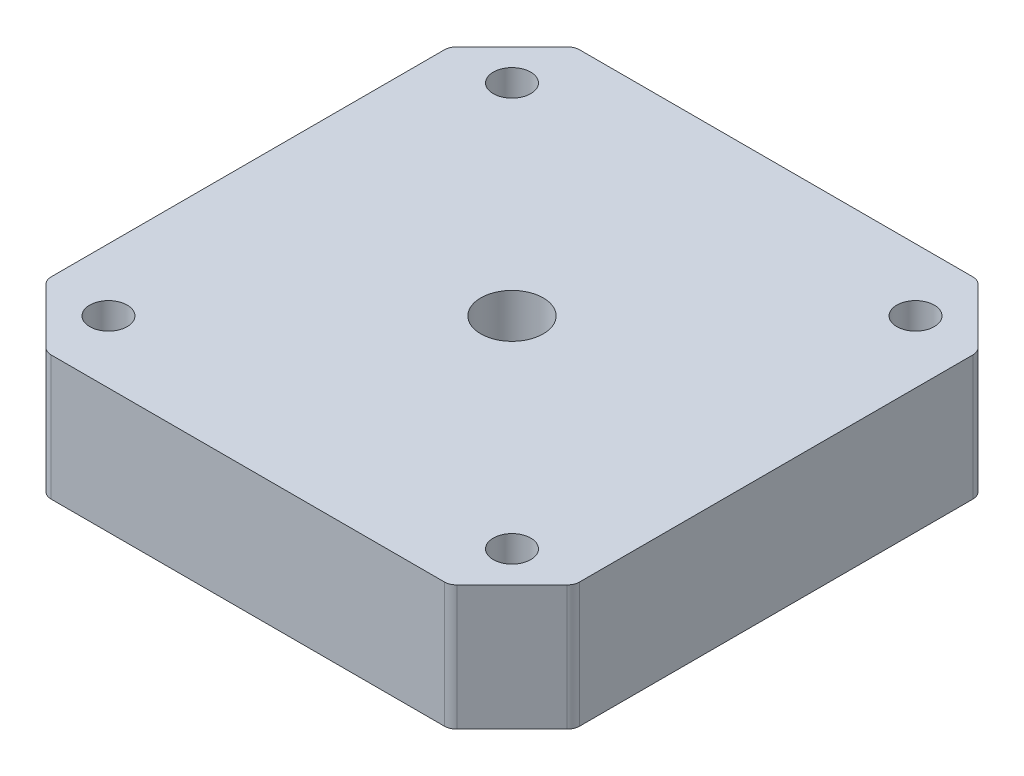
ISO-10303-21;
HEADER;
FILE_DESCRIPTION(('STEP AP214'),'2;1');
FILE_NAME('part.step','',(''),(''),'','','');
FILE_SCHEMA(('AUTOMOTIVE_DESIGN { 1 0 10303 214 1 1 1 1 }'));
ENDSEC;
DATA;
#1=APPLICATION_CONTEXT('core data for automotive mechanical design processes');
#2=APPLICATION_PROTOCOL_DEFINITION('international standard','automotive_design',2000,#1);
#3=PRODUCT_CONTEXT('',#1,'mechanical');
#4=PRODUCT('Part','Part','',(#3));
#5=PRODUCT_RELATED_PRODUCT_CATEGORY('part','',(#4));
#6=PRODUCT_DEFINITION_FORMATION('','',#4);
#7=PRODUCT_DEFINITION_CONTEXT('part definition',#1,'design');
#8=PRODUCT_DEFINITION('design','',#6,#7);
#9=PRODUCT_DEFINITION_SHAPE('','',#8);
#10=(LENGTH_UNIT() NAMED_UNIT(*) SI_UNIT(.MILLI.,.METRE.));
#11=(NAMED_UNIT(*) PLANE_ANGLE_UNIT() SI_UNIT($,.RADIAN.));
#12=(NAMED_UNIT(*) SI_UNIT($,.STERADIAN.) SOLID_ANGLE_UNIT());
#13=UNCERTAINTY_MEASURE_WITH_UNIT(LENGTH_MEASURE(1.E-05),#10,'distance_accuracy_value','');
#14=(GEOMETRIC_REPRESENTATION_CONTEXT(3) GLOBAL_UNCERTAINTY_ASSIGNED_CONTEXT((#13)) GLOBAL_UNIT_ASSIGNED_CONTEXT((#10,
#11,#12)) REPRESENTATION_CONTEXT('',''));
#15=CARTESIAN_POINT('',(0.,0.,0.));
#16=DIRECTION('',(0.,0.,1.));
#17=DIRECTION('',(1.,0.,0.));
#18=AXIS2_PLACEMENT_3D('',#15,#16,#17);
#19=CARTESIAN_POINT('',(1.,10.,-36.8857864376268));
#20=DIRECTION('',(0.,-1.,0.));
#21=DIRECTION('',(0.,0.,-1.));
#22=AXIS2_PLACEMENT_3D('',#19,#20,#21);
#23=CYLINDRICAL_SURFACE('',#22,1.);
#24=DIRECTION('',(0.,1.,0.));
#25=VECTOR('',#24,1.);
#26=CARTESIAN_POINT('',(0.292893218813445,10.,-37.5928932188133));
#27=LINE('',#26,#25);
#28=CARTESIAN_POINT('',(0.292893218813452,0.,-37.5928932188133));
#29=VERTEX_POINT('',#28);
#30=CARTESIAN_POINT('',(0.292893218813452,10.,-37.5928932188133));
#31=VERTEX_POINT('',#30);
#32=EDGE_CURVE('E246',#29,#31,#27,.T.);
#33=ORIENTED_EDGE('',*,*,#32,.F.);
#34=CARTESIAN_POINT('',(1.,0.,-36.8857864376268));
#35=DIRECTION('',(0.,1.,0.));
#36=DIRECTION('',(0.,0.,1.));
#37=AXIS2_PLACEMENT_3D('',#34,#35,#36);
#38=CIRCLE('',#37,1.);
#39=CARTESIAN_POINT('',(0.,0.,-36.8857864376268));
#40=VERTEX_POINT('',#39);
#41=EDGE_CURVE('E55',#40,#29,#38,.F.);
#42=ORIENTED_EDGE('',*,*,#41,.F.);
#43=DIRECTION('',(0.,1.,0.));
#44=VECTOR('',#43,1.);
#45=CARTESIAN_POINT('',(0.,10.,-36.8857864376268));
#46=LINE('',#45,#44);
#47=CARTESIAN_POINT('',(0.,10.,-36.8857864376268));
#48=VERTEX_POINT('',#47);
#49=EDGE_CURVE('E168',#48,#40,#46,.F.);
#50=ORIENTED_EDGE('',*,*,#49,.F.);
#51=CARTESIAN_POINT('',(1.,10.,-36.8857864376268));
#52=DIRECTION('',(0.,1.,0.));
#53=DIRECTION('',(0.,0.,1.));
#54=AXIS2_PLACEMENT_3D('',#51,#52,#53);
#55=CIRCLE('',#54,1.);
#56=EDGE_CURVE('E42',#31,#48,#55,.T.);
#57=ORIENTED_EDGE('',*,*,#56,.F.);
#58=EDGE_LOOP('',(#33,#42,#50,#57));
#59=FACE_BOUND('',#58,.T.);
#60=ADVANCED_FACE('F35',(#59),#23,.T.);
#61=CARTESIAN_POINT('',(5.41421356237311,10.,-41.3));
#62=DIRECTION('',(0.,-1.,0.));
#63=DIRECTION('',(0.,0.,-1.));
#64=AXIS2_PLACEMENT_3D('',#61,#62,#63);
#65=CYLINDRICAL_SURFACE('',#64,1.);
#66=DIRECTION('',(0.,1.,0.));
#67=VECTOR('',#66,1.);
#68=CARTESIAN_POINT('',(5.41421356237311,10.,-42.3));
#69=LINE('',#68,#67);
#70=CARTESIAN_POINT('',(5.41421356237311,0.,-42.3));
#71=VERTEX_POINT('',#70);
#72=CARTESIAN_POINT('',(5.41421356237311,10.,-42.3));
#73=VERTEX_POINT('',#72);
#74=EDGE_CURVE('E236',#71,#73,#69,.T.);
#75=ORIENTED_EDGE('',*,*,#74,.F.);
#76=CARTESIAN_POINT('',(5.41421356237311,0.,-41.3));
#77=DIRECTION('',(0.,1.,0.));
#78=DIRECTION('',(0.,0.,1.));
#79=AXIS2_PLACEMENT_3D('',#76,#77,#78);
#80=CIRCLE('',#79,1.);
#81=CARTESIAN_POINT('',(4.70710678118655,0.,-42.0071067811865));
#82=VERTEX_POINT('',#81);
#83=EDGE_CURVE('E242',#82,#71,#80,.F.);
#84=ORIENTED_EDGE('',*,*,#83,.F.);
#85=DIRECTION('',(0.,1.,0.));
#86=VECTOR('',#85,1.);
#87=CARTESIAN_POINT('',(4.70710678118655,10.,-42.0071067811865));
#88=LINE('',#87,#86);
#89=CARTESIAN_POINT('',(4.70710678118655,10.,-42.0071067811865));
#90=VERTEX_POINT('',#89);
#91=EDGE_CURVE('E239',#90,#82,#88,.F.);
#92=ORIENTED_EDGE('',*,*,#91,.F.);
#93=CARTESIAN_POINT('',(5.41421356237311,10.,-41.3));
#94=DIRECTION('',(0.,1.,0.));
#95=DIRECTION('',(0.,0.,1.));
#96=AXIS2_PLACEMENT_3D('',#93,#94,#95);
#97=CIRCLE('',#96,1.);
#98=EDGE_CURVE('E244',#73,#90,#97,.T.);
#99=ORIENTED_EDGE('',*,*,#98,.F.);
#100=EDGE_LOOP('',(#75,#84,#92,#99));
#101=FACE_BOUND('',#100,.T.);
#102=ADVANCED_FACE('F258',(#101),#65,.T.);
#103=CARTESIAN_POINT('',(36.8857864376269,10.,-41.3));
#104=DIRECTION('',(0.,1.,0.));
#105=DIRECTION('',(0.,0.,1.));
#106=AXIS2_PLACEMENT_3D('',#103,#104,#105);
#107=CYLINDRICAL_SURFACE('',#106,1.);
#108=DIRECTION('',(0.,1.,0.));
#109=VECTOR('',#108,1.);
#110=CARTESIAN_POINT('',(37.5928932188135,10.,-42.0071067811865));
#111=LINE('',#110,#109);
#112=CARTESIAN_POINT('',(37.5928932188135,0.,-42.0071067811865));
#113=VERTEX_POINT('',#112);
#114=CARTESIAN_POINT('',(37.5928932188135,10.,-42.0071067811865));
#115=VERTEX_POINT('',#114);
#116=EDGE_CURVE('E225',#113,#115,#111,.T.);
#117=ORIENTED_EDGE('',*,*,#116,.F.);
#118=CARTESIAN_POINT('',(36.8857864376269,0.,-41.3));
#119=DIRECTION('',(0.,1.,0.));
#120=DIRECTION('',(0.,0.,1.));
#121=AXIS2_PLACEMENT_3D('',#118,#119,#120);
#122=CIRCLE('',#121,1.);
#123=CARTESIAN_POINT('',(36.8857864376269,0.,-42.3));
#124=VERTEX_POINT('',#123);
#125=EDGE_CURVE('E231',#124,#113,#122,.F.);
#126=ORIENTED_EDGE('',*,*,#125,.F.);
#127=DIRECTION('',(0.,1.,0.));
#128=VECTOR('',#127,1.);
#129=CARTESIAN_POINT('',(36.8857864376269,10.,-42.3));
#130=LINE('',#129,#128);
#131=CARTESIAN_POINT('',(36.8857864376269,10.,-42.3));
#132=VERTEX_POINT('',#131);
#133=EDGE_CURVE('E228',#132,#124,#130,.F.);
#134=ORIENTED_EDGE('',*,*,#133,.F.);
#135=CARTESIAN_POINT('',(36.8857864376269,10.,-41.3));
#136=DIRECTION('',(0.,1.,0.));
#137=DIRECTION('',(0.,0.,1.));
#138=AXIS2_PLACEMENT_3D('',#135,#136,#137);
#139=CIRCLE('',#138,1.);
#140=EDGE_CURVE('E233',#115,#132,#139,.T.);
#141=ORIENTED_EDGE('',*,*,#140,.F.);
#142=EDGE_LOOP('',(#117,#126,#134,#141));
#143=FACE_BOUND('',#142,.T.);
#144=ADVANCED_FACE('F266',(#143),#107,.T.);
#145=CARTESIAN_POINT('',(41.3,10.,-36.885786437627));
#146=DIRECTION('',(0.,-1.,0.));
#147=DIRECTION('',(0.,0.,-1.));
#148=AXIS2_PLACEMENT_3D('',#145,#146,#147);
#149=CYLINDRICAL_SURFACE('',#148,1.);
#150=DIRECTION('',(0.,1.,0.));
#151=VECTOR('',#150,1.);
#152=CARTESIAN_POINT('',(42.3,10.,-36.885786437627));
#153=LINE('',#152,#151);
#154=CARTESIAN_POINT('',(42.3,0.,-36.885786437627));
#155=VERTEX_POINT('',#154);
#156=CARTESIAN_POINT('',(42.3,10.,-36.885786437627));
#157=VERTEX_POINT('',#156);
#158=EDGE_CURVE('E214',#155,#157,#153,.T.);
#159=ORIENTED_EDGE('',*,*,#158,.F.);
#160=CARTESIAN_POINT('',(41.3,0.,-36.885786437627));
#161=DIRECTION('',(0.,1.,0.));
#162=DIRECTION('',(0.,0.,1.));
#163=AXIS2_PLACEMENT_3D('',#160,#161,#162);
#164=CIRCLE('',#163,1.);
#165=CARTESIAN_POINT('',(42.0071067811865,0.,-37.5928932188136));
#166=VERTEX_POINT('',#165);
#167=EDGE_CURVE('E220',#166,#155,#164,.F.);
#168=ORIENTED_EDGE('',*,*,#167,.F.);
#169=DIRECTION('',(0.,1.,0.));
#170=VECTOR('',#169,1.);
#171=CARTESIAN_POINT('',(42.0071067811865,10.,-37.5928932188136));
#172=LINE('',#171,#170);
#173=CARTESIAN_POINT('',(42.0071067811865,10.,-37.5928932188136));
#174=VERTEX_POINT('',#173);
#175=EDGE_CURVE('E217',#174,#166,#172,.F.);
#176=ORIENTED_EDGE('',*,*,#175,.F.);
#177=CARTESIAN_POINT('',(41.3,10.,-36.885786437627));
#178=DIRECTION('',(0.,1.,0.));
#179=DIRECTION('',(0.,0.,1.));
#180=AXIS2_PLACEMENT_3D('',#177,#178,#179);
#181=CIRCLE('',#180,1.);
#182=EDGE_CURVE('E222',#157,#174,#181,.T.);
#183=ORIENTED_EDGE('',*,*,#182,.F.);
#184=EDGE_LOOP('',(#159,#168,#176,#183));
#185=FACE_BOUND('',#184,.T.);
#186=ADVANCED_FACE('F377',(#185),#149,.T.);
#187=CARTESIAN_POINT('',(41.3,10.,-5.41421356237309));
#188=DIRECTION('',(0.,-1.,0.));
#189=DIRECTION('',(0.,0.,-1.));
#190=AXIS2_PLACEMENT_3D('',#187,#188,#189);
#191=CYLINDRICAL_SURFACE('',#190,1.);
#192=DIRECTION('',(0.,1.,0.));
#193=VECTOR('',#192,1.);
#194=CARTESIAN_POINT('',(42.0071067811866,10.,-4.70710678118655));
#195=LINE('',#194,#193);
#196=CARTESIAN_POINT('',(42.0071067811866,0.,-4.70710678118655));
#197=VERTEX_POINT('',#196);
#198=CARTESIAN_POINT('',(42.0071067811866,10.,-4.70710678118655));
#199=VERTEX_POINT('',#198);
#200=EDGE_CURVE('E204',#197,#199,#195,.T.);
#201=ORIENTED_EDGE('',*,*,#200,.F.);
#202=CARTESIAN_POINT('',(41.3,0.,-5.41421356237309));
#203=DIRECTION('',(0.,1.,0.));
#204=DIRECTION('',(0.,0.,1.));
#205=AXIS2_PLACEMENT_3D('',#202,#203,#204);
#206=CIRCLE('',#205,1.);
#207=CARTESIAN_POINT('',(42.3,0.,-5.41421356237309));
#208=VERTEX_POINT('',#207);
#209=EDGE_CURVE('E210',#208,#197,#206,.F.);
#210=ORIENTED_EDGE('',*,*,#209,.F.);
#211=DIRECTION('',(0.,1.,0.));
#212=VECTOR('',#211,1.);
#213=CARTESIAN_POINT('',(42.3,10.,-5.41421356237309));
#214=LINE('',#213,#212);
#215=CARTESIAN_POINT('',(42.3,10.,-5.41421356237309));
#216=VERTEX_POINT('',#215);
#217=EDGE_CURVE('E207',#216,#208,#214,.F.);
#218=ORIENTED_EDGE('',*,*,#217,.F.);
#219=CARTESIAN_POINT('',(41.3,10.,-5.41421356237309));
#220=DIRECTION('',(0.,1.,0.));
#221=DIRECTION('',(0.,0.,1.));
#222=AXIS2_PLACEMENT_3D('',#219,#220,#221);
#223=CIRCLE('',#222,1.);
#224=EDGE_CURVE('E212',#199,#216,#223,.T.);
#225=ORIENTED_EDGE('',*,*,#224,.F.);
#226=EDGE_LOOP('',(#201,#210,#218,#225));
#227=FACE_BOUND('',#226,.T.);
#228=ADVANCED_FACE('F382',(#227),#191,.T.);
#229=CARTESIAN_POINT('',(36.885786437627,10.,-1.));
#230=DIRECTION('',(0.,-1.,0.));
#231=DIRECTION('',(0.,0.,-1.));
#232=AXIS2_PLACEMENT_3D('',#229,#230,#231);
#233=CYLINDRICAL_SURFACE('',#232,1.);
#234=DIRECTION('',(0.,1.,0.));
#235=VECTOR('',#234,1.);
#236=CARTESIAN_POINT('',(36.885786437627,10.,0.));
#237=LINE('',#236,#235);
#238=CARTESIAN_POINT('',(36.885786437627,0.,0.));
#239=VERTEX_POINT('',#238);
#240=CARTESIAN_POINT('',(36.885786437627,10.,0.));
#241=VERTEX_POINT('',#240);
#242=EDGE_CURVE('E193',#239,#241,#237,.T.);
#243=ORIENTED_EDGE('',*,*,#242,.F.);
#244=CARTESIAN_POINT('',(36.885786437627,0.,-1.));
#245=DIRECTION('',(0.,1.,0.));
#246=DIRECTION('',(0.,0.,1.));
#247=AXIS2_PLACEMENT_3D('',#244,#245,#246);
#248=CIRCLE('',#247,1.);
#249=CARTESIAN_POINT('',(37.5928932188135,0.,-0.292893218813456));
#250=VERTEX_POINT('',#249);
#251=EDGE_CURVE('E199',#250,#239,#248,.F.);
#252=ORIENTED_EDGE('',*,*,#251,.F.);
#253=DIRECTION('',(0.,1.,0.));
#254=VECTOR('',#253,1.);
#255=CARTESIAN_POINT('',(37.5928932188135,10.,-0.292893218813459));
#256=LINE('',#255,#254);
#257=CARTESIAN_POINT('',(37.5928932188135,10.,-0.292893218813456));
#258=VERTEX_POINT('',#257);
#259=EDGE_CURVE('E196',#258,#250,#256,.F.);
#260=ORIENTED_EDGE('',*,*,#259,.F.);
#261=CARTESIAN_POINT('',(36.885786437627,10.,-1.));
#262=DIRECTION('',(0.,1.,0.));
#263=DIRECTION('',(0.,0.,1.));
#264=AXIS2_PLACEMENT_3D('',#261,#262,#263);
#265=CIRCLE('',#264,1.);
#266=EDGE_CURVE('E201',#241,#258,#265,.T.);
#267=ORIENTED_EDGE('',*,*,#266,.F.);
#268=EDGE_LOOP('',(#243,#252,#260,#267));
#269=FACE_BOUND('',#268,.T.);
#270=ADVANCED_FACE('F386',(#269),#233,.T.);
#271=CARTESIAN_POINT('',(5.41421356237321,10.,-1.));
#272=DIRECTION('',(0.,1.,0.));
#273=DIRECTION('',(0.,0.,1.));
#274=AXIS2_PLACEMENT_3D('',#271,#272,#273);
#275=CYLINDRICAL_SURFACE('',#274,1.);
#276=DIRECTION('',(0.,1.,0.));
#277=VECTOR('',#276,1.);
#278=CARTESIAN_POINT('',(4.70710678118667,10.,-0.292893218813444));
#279=LINE('',#278,#277);
#280=CARTESIAN_POINT('',(4.70710678118667,0.,-0.292893218813444));
#281=VERTEX_POINT('',#280);
#282=CARTESIAN_POINT('',(4.70710678118667,10.,-0.292893218813444));
#283=VERTEX_POINT('',#282);
#284=EDGE_CURVE('E183',#281,#283,#279,.T.);
#285=ORIENTED_EDGE('',*,*,#284,.F.);
#286=CARTESIAN_POINT('',(5.41421356237321,0.,-1.));
#287=DIRECTION('',(0.,1.,0.));
#288=DIRECTION('',(0.,0.,1.));
#289=AXIS2_PLACEMENT_3D('',#286,#287,#288);
#290=CIRCLE('',#289,1.);
#291=CARTESIAN_POINT('',(5.41421356237321,0.,0.));
#292=VERTEX_POINT('',#291);
#293=EDGE_CURVE('E189',#292,#281,#290,.F.);
#294=ORIENTED_EDGE('',*,*,#293,.F.);
#295=DIRECTION('',(0.,1.,0.));
#296=VECTOR('',#295,1.);
#297=CARTESIAN_POINT('',(5.41421356237321,10.,0.));
#298=LINE('',#297,#296);
#299=CARTESIAN_POINT('',(5.41421356237321,10.,0.));
#300=VERTEX_POINT('',#299);
#301=EDGE_CURVE('E186',#300,#292,#298,.F.);
#302=ORIENTED_EDGE('',*,*,#301,.F.);
#303=CARTESIAN_POINT('',(5.41421356237321,10.,-1.));
#304=DIRECTION('',(0.,1.,0.));
#305=DIRECTION('',(0.,0.,1.));
#306=AXIS2_PLACEMENT_3D('',#303,#304,#305);
#307=CIRCLE('',#306,1.);
#308=EDGE_CURVE('E191',#283,#300,#307,.T.);
#309=ORIENTED_EDGE('',*,*,#308,.F.);
#310=EDGE_LOOP('',(#285,#294,#302,#309));
#311=FACE_BOUND('',#310,.T.);
#312=ADVANCED_FACE('F390',(#311),#275,.T.);
#313=CARTESIAN_POINT('',(1.,10.,-5.4142135623731));
#314=DIRECTION('',(0.,-1.,0.));
#315=DIRECTION('',(0.,0.,-1.));
#316=AXIS2_PLACEMENT_3D('',#313,#314,#315);
#317=CYLINDRICAL_SURFACE('',#316,1.);
#318=DIRECTION('',(0.,1.,0.));
#319=VECTOR('',#318,1.);
#320=CARTESIAN_POINT('',(0.,10.,-5.4142135623731));
#321=LINE('',#320,#319);
#322=CARTESIAN_POINT('',(0.,0.,-5.4142135623731));
#323=VERTEX_POINT('',#322);
#324=CARTESIAN_POINT('',(0.,10.,-5.4142135623731));
#325=VERTEX_POINT('',#324);
#326=EDGE_CURVE('E161',#323,#325,#321,.T.);
#327=ORIENTED_EDGE('',*,*,#326,.F.);
#328=CARTESIAN_POINT('',(1.,0.,-5.4142135623731));
#329=DIRECTION('',(0.,1.,0.));
#330=DIRECTION('',(0.,0.,1.));
#331=AXIS2_PLACEMENT_3D('',#328,#329,#330);
#332=CIRCLE('',#331,1.);
#333=CARTESIAN_POINT('',(0.292893218813461,0.,-4.70710678118655));
#334=VERTEX_POINT('',#333);
#335=EDGE_CURVE('E147',#334,#323,#332,.F.);
#336=ORIENTED_EDGE('',*,*,#335,.F.);
#337=DIRECTION('',(0.,1.,0.));
#338=VECTOR('',#337,1.);
#339=CARTESIAN_POINT('',(0.292893218813461,10.,-4.70710678118655));
#340=LINE('',#339,#338);
#341=CARTESIAN_POINT('',(0.292893218813461,10.,-4.70710678118655));
#342=VERTEX_POINT('',#341);
#343=EDGE_CURVE('E158',#342,#334,#340,.F.);
#344=ORIENTED_EDGE('',*,*,#343,.F.);
#345=CARTESIAN_POINT('',(1.,10.,-5.4142135623731));
#346=DIRECTION('',(0.,1.,0.));
#347=DIRECTION('',(0.,0.,1.));
#348=AXIS2_PLACEMENT_3D('',#345,#346,#347);
#349=CIRCLE('',#348,1.);
#350=EDGE_CURVE('E157',#325,#342,#349,.T.);
#351=ORIENTED_EDGE('',*,*,#350,.F.);
#352=EDGE_LOOP('',(#327,#336,#344,#351));
#353=FACE_BOUND('',#352,.T.);
#354=ADVANCED_FACE('F162',(#353),#317,.T.);
#355=CARTESIAN_POINT('',(18.6500000000004,10.,18.65));
#356=DIRECTION('',(0.707106781186553,0.,0.707106781186542));
#357=DIRECTION('',(0.707106781186542,0.,-0.707106781186553));
#358=AXIS2_PLACEMENT_3D('',#355,#356,#357);
#359=PLANE('',#358);
#360=DIRECTION('',(-0.707106781186542,0.,0.707106781186553));
#361=VECTOR('',#360,1.);
#362=CARTESIAN_POINT('',(18.6500000000004,0.,18.65));
#363=LINE('',#362,#361);
#364=EDGE_CURVE('E282',#197,#250,#363,.T.);
#365=ORIENTED_EDGE('',*,*,#364,.F.);
#366=ORIENTED_EDGE('',*,*,#200,.T.);
#367=DIRECTION('',(-0.707106781186542,0.,0.707106781186553));
#368=VECTOR('',#367,1.);
#369=CARTESIAN_POINT('',(18.6500000000004,10.,18.65));
#370=LINE('',#369,#368);
#371=EDGE_CURVE('E311',#199,#258,#370,.T.);
#372=ORIENTED_EDGE('',*,*,#371,.T.);
#373=ORIENTED_EDGE('',*,*,#259,.T.);
#374=EDGE_LOOP('',(#365,#366,#372,#373));
#375=FACE_BOUND('',#374,.T.);
#376=ADVANCED_FACE('F397',(#375),#359,.T.);
#377=CARTESIAN_POINT('',(42.3,10.,0.));
#378=DIRECTION('',(-1.,0.,0.));
#379=DIRECTION('',(0.,0.,1.));
#380=AXIS2_PLACEMENT_3D('',#377,#378,#379);
#381=PLANE('',#380);
#382=DIRECTION('',(0.,0.,-1.));
#383=VECTOR('',#382,1.);
#384=CARTESIAN_POINT('',(42.3,0.,0.));
#385=LINE('',#384,#383);
#386=EDGE_CURVE('E279',#208,#155,#385,.T.);
#387=ORIENTED_EDGE('',*,*,#386,.T.);
#388=ORIENTED_EDGE('',*,*,#158,.T.);
#389=DIRECTION('',(0.,0.,-1.));
#390=VECTOR('',#389,1.);
#391=CARTESIAN_POINT('',(42.3,10.,0.));
#392=LINE('',#391,#390);
#393=EDGE_CURVE('E308',#216,#157,#392,.T.);
#394=ORIENTED_EDGE('',*,*,#393,.F.);
#395=ORIENTED_EDGE('',*,*,#217,.T.);
#396=EDGE_LOOP('',(#387,#388,#394,#395));
#397=FACE_BOUND('',#396,.T.);
#398=ADVANCED_FACE('F411',(#397),#381,.F.);
#399=CARTESIAN_POINT('',(39.7999999999996,10.,-39.8000000000005));
#400=DIRECTION('',(0.70710678118654,0.,-0.707106781186555));
#401=DIRECTION('',(-0.707106781186555,0.,-0.70710678118654));
#402=AXIS2_PLACEMENT_3D('',#399,#400,#401);
#403=PLANE('',#402);
#404=DIRECTION('',(0.707106781186555,0.,0.70710678118654));
#405=VECTOR('',#404,1.);
#406=CARTESIAN_POINT('',(39.7999999999996,0.,-39.8000000000005));
#407=LINE('',#406,#405);
#408=EDGE_CURVE('E263',#113,#166,#407,.T.);
#409=ORIENTED_EDGE('',*,*,#408,.F.);
#410=ORIENTED_EDGE('',*,*,#116,.T.);
#411=DIRECTION('',(0.707106781186555,0.,0.70710678118654));
#412=VECTOR('',#411,1.);
#413=CARTESIAN_POINT('',(39.7999999999996,10.,-39.8000000000005));
#414=LINE('',#413,#412);
#415=EDGE_CURVE('E271',#115,#174,#414,.T.);
#416=ORIENTED_EDGE('',*,*,#415,.T.);
#417=ORIENTED_EDGE('',*,*,#175,.T.);
#418=EDGE_LOOP('',(#409,#410,#416,#417));
#419=FACE_BOUND('',#418,.T.);
#420=ADVANCED_FACE('F276',(#419),#403,.T.);
#421=CARTESIAN_POINT('',(0.,10.,-42.3));
#422=DIRECTION('',(0.,0.,-1.));
#423=DIRECTION('',(-1.,0.,0.));
#424=AXIS2_PLACEMENT_3D('',#421,#422,#423);
#425=PLANE('',#424);
#426=DIRECTION('',(1.,0.,0.));
#427=VECTOR('',#426,1.);
#428=CARTESIAN_POINT('',(0.,0.,-42.3));
#429=LINE('',#428,#427);
#430=EDGE_CURVE('E174',#71,#124,#429,.T.);
#431=ORIENTED_EDGE('',*,*,#430,.F.);
#432=ORIENTED_EDGE('',*,*,#74,.T.);
#433=DIRECTION('',(1.,0.,0.));
#434=VECTOR('',#433,1.);
#435=CARTESIAN_POINT('',(0.,10.,-42.3));
#436=LINE('',#435,#434);
#437=EDGE_CURVE('E270',#73,#132,#436,.T.);
#438=ORIENTED_EDGE('',*,*,#437,.T.);
#439=ORIENTED_EDGE('',*,*,#133,.T.);
#440=EDGE_LOOP('',(#431,#432,#438,#439));
#441=FACE_BOUND('',#440,.T.);
#442=ADVANCED_FACE('F268',(#441),#425,.T.);
#443=CARTESIAN_POINT('',(-18.6499999999999,10.,-18.6499999999996));
#444=DIRECTION('',(0.707106781186554,0.,0.707106781186541));
#445=DIRECTION('',(0.707106781186541,0.,-0.707106781186554));
#446=AXIS2_PLACEMENT_3D('',#443,#444,#445);
#447=PLANE('',#446);
#448=DIRECTION('',(-0.707106781186541,0.,0.707106781186554));
#449=VECTOR('',#448,1.);
#450=CARTESIAN_POINT('',(-18.6499999999999,0.,-18.6499999999996));
#451=LINE('',#450,#449);
#452=EDGE_CURVE('E169',#82,#29,#451,.T.);
#453=ORIENTED_EDGE('',*,*,#452,.T.);
#454=ORIENTED_EDGE('',*,*,#32,.T.);
#455=DIRECTION('',(-0.707106781186541,0.,0.707106781186554));
#456=VECTOR('',#455,1.);
#457=CARTESIAN_POINT('',(-18.6499999999999,10.,-18.6499999999996));
#458=LINE('',#457,#456);
#459=EDGE_CURVE('E255',#90,#31,#458,.T.);
#460=ORIENTED_EDGE('',*,*,#459,.F.);
#461=ORIENTED_EDGE('',*,*,#91,.T.);
#462=EDGE_LOOP('',(#453,#454,#460,#461));
#463=FACE_BOUND('',#462,.T.);
#464=ADVANCED_FACE('F253',(#463),#447,.F.);
#465=CARTESIAN_POINT('',(0.,10.,0.));
#466=DIRECTION('',(-1.,0.,0.));
#467=DIRECTION('',(0.,0.,1.));
#468=AXIS2_PLACEMENT_3D('',#465,#466,#467);
#469=PLANE('',#468);
#470=DIRECTION('',(0.,0.,-1.));
#471=VECTOR('',#470,1.);
#472=CARTESIAN_POINT('',(0.,10.,0.));
#473=LINE('',#472,#471);
#474=EDGE_CURVE('E304',#325,#48,#473,.T.);
#475=ORIENTED_EDGE('',*,*,#474,.T.);
#476=ORIENTED_EDGE('',*,*,#49,.T.);
#477=DIRECTION('',(0.,0.,-1.));
#478=VECTOR('',#477,1.);
#479=CARTESIAN_POINT('',(0.,0.,0.));
#480=LINE('',#479,#478);
#481=EDGE_CURVE('E151',#323,#40,#480,.T.);
#482=ORIENTED_EDGE('',*,*,#481,.F.);
#483=ORIENTED_EDGE('',*,*,#326,.T.);
#484=EDGE_LOOP('',(#475,#476,#482,#483));
#485=FACE_BOUND('',#484,.T.);
#486=ADVANCED_FACE('F167',(#485),#469,.T.);
#487=CARTESIAN_POINT('',(2.5,10.,-2.50000000000006));
#488=DIRECTION('',(0.707106781186539,0.,-0.707106781186556));
#489=DIRECTION('',(-0.707106781186556,0.,-0.707106781186539));
#490=AXIS2_PLACEMENT_3D('',#487,#488,#489);
#491=PLANE('',#490);
#492=DIRECTION('',(0.707106781186556,0.,0.707106781186539));
#493=VECTOR('',#492,1.);
#494=CARTESIAN_POINT('',(2.5,0.,-2.50000000000006));
#495=LINE('',#494,#493);
#496=EDGE_CURVE('E153',#334,#281,#495,.T.);
#497=ORIENTED_EDGE('',*,*,#496,.T.);
#498=ORIENTED_EDGE('',*,*,#284,.T.);
#499=DIRECTION('',(0.707106781186556,0.,0.707106781186539));
#500=VECTOR('',#499,1.);
#501=CARTESIAN_POINT('',(2.5,10.,-2.50000000000006));
#502=LINE('',#501,#500);
#503=EDGE_CURVE('E301',#342,#283,#502,.T.);
#504=ORIENTED_EDGE('',*,*,#503,.F.);
#505=ORIENTED_EDGE('',*,*,#343,.T.);
#506=EDGE_LOOP('',(#497,#498,#504,#505));
#507=FACE_BOUND('',#506,.T.);
#508=ADVANCED_FACE('F351',(#507),#491,.F.);
#509=CARTESIAN_POINT('',(5.,10.,-5.));
#510=DIRECTION('',(0.,-1.,0.));
#511=DIRECTION('',(0.,0.,-1.));
#512=AXIS2_PLACEMENT_3D('',#509,#510,#511);
#513=CYLINDRICAL_SURFACE('',#512,1.5);
#514=CARTESIAN_POINT('',(5.,10.,-5.));
#515=DIRECTION('',(0.,1.,0.));
#516=DIRECTION('',(0.,0.,1.));
#517=AXIS2_PLACEMENT_3D('',#514,#515,#516);
#518=CIRCLE('',#517,1.5);
#519=CARTESIAN_POINT('',(5.,10.,-3.5));
#520=VERTEX_POINT('',#519);
#521=EDGE_CURVE('E313',#520,#520,#518,.T.);
#522=ORIENTED_EDGE('',*,*,#521,.T.);
#523=EDGE_LOOP('',(#522));
#524=FACE_BOUND('',#523,.T.);
#525=CARTESIAN_POINT('',(5.,0.,-5.));
#526=DIRECTION('',(0.,1.,0.));
#527=DIRECTION('',(0.,0.,1.));
#528=AXIS2_PLACEMENT_3D('',#525,#526,#527);
#529=CIRCLE('',#528,1.5);
#530=CARTESIAN_POINT('',(5.,0.,-3.5));
#531=VERTEX_POINT('',#530);
#532=EDGE_CURVE('E286',#531,#531,#529,.T.);
#533=ORIENTED_EDGE('',*,*,#532,.F.);
#534=EDGE_LOOP('',(#533));
#535=FACE_BOUND('',#534,.T.);
#536=ADVANCED_FACE('F347',(#524,#535),#513,.F.);
#537=CARTESIAN_POINT('',(5.,10.,-37.3));
#538=DIRECTION('',(0.,-1.,0.));
#539=DIRECTION('',(0.,0.,-1.));
#540=AXIS2_PLACEMENT_3D('',#537,#538,#539);
#541=CYLINDRICAL_SURFACE('',#540,1.5);
#542=CARTESIAN_POINT('',(5.,10.,-37.3));
#543=DIRECTION('',(0.,1.,0.));
#544=DIRECTION('',(0.,0.,1.));
#545=AXIS2_PLACEMENT_3D('',#542,#543,#544);
#546=CIRCLE('',#545,1.5);
#547=CARTESIAN_POINT('',(5.,10.,-35.8));
#548=VERTEX_POINT('',#547);
#549=EDGE_CURVE('E316',#548,#548,#546,.T.);
#550=ORIENTED_EDGE('',*,*,#549,.T.);
#551=EDGE_LOOP('',(#550));
#552=FACE_BOUND('',#551,.T.);
#553=CARTESIAN_POINT('',(5.,0.,-37.3));
#554=DIRECTION('',(0.,1.,0.));
#555=DIRECTION('',(0.,0.,1.));
#556=AXIS2_PLACEMENT_3D('',#553,#554,#555);
#557=CIRCLE('',#556,1.5);
#558=CARTESIAN_POINT('',(5.,0.,-35.8));
#559=VERTEX_POINT('',#558);
#560=EDGE_CURVE('E289',#559,#559,#557,.T.);
#561=ORIENTED_EDGE('',*,*,#560,.F.);
#562=EDGE_LOOP('',(#561));
#563=FACE_BOUND('',#562,.T.);
#564=ADVANCED_FACE('F350',(#552,#563),#541,.F.);
#565=CARTESIAN_POINT('',(37.3,10.,-37.3));
#566=DIRECTION('',(0.,-1.,0.));
#567=DIRECTION('',(0.,0.,-1.));
#568=AXIS2_PLACEMENT_3D('',#565,#566,#567);
#569=CYLINDRICAL_SURFACE('',#568,1.5);
#570=CARTESIAN_POINT('',(37.3,10.,-37.3));
#571=DIRECTION('',(0.,1.,0.));
#572=DIRECTION('',(0.,0.,1.));
#573=AXIS2_PLACEMENT_3D('',#570,#571,#572);
#574=CIRCLE('',#573,1.5);
#575=CARTESIAN_POINT('',(37.3,10.,-35.8));
#576=VERTEX_POINT('',#575);
#577=EDGE_CURVE('E319',#576,#576,#574,.T.);
#578=ORIENTED_EDGE('',*,*,#577,.T.);
#579=EDGE_LOOP('',(#578));
#580=FACE_BOUND('',#579,.T.);
#581=CARTESIAN_POINT('',(37.3,0.,-37.3));
#582=DIRECTION('',(0.,1.,0.));
#583=DIRECTION('',(0.,0.,1.));
#584=AXIS2_PLACEMENT_3D('',#581,#582,#583);
#585=CIRCLE('',#584,1.5);
#586=CARTESIAN_POINT('',(37.3,0.,-35.8));
#587=VERTEX_POINT('',#586);
#588=EDGE_CURVE('E292',#587,#587,#585,.T.);
#589=ORIENTED_EDGE('',*,*,#588,.F.);
#590=EDGE_LOOP('',(#589));
#591=FACE_BOUND('',#590,.T.);
#592=ADVANCED_FACE('F401',(#580,#591),#569,.F.);
#593=CARTESIAN_POINT('',(37.3,10.,-5.));
#594=DIRECTION('',(0.,-1.,0.));
#595=DIRECTION('',(0.,0.,-1.));
#596=AXIS2_PLACEMENT_3D('',#593,#594,#595);
#597=CYLINDRICAL_SURFACE('',#596,1.5);
#598=CARTESIAN_POINT('',(37.3,10.,-5.));
#599=DIRECTION('',(0.,1.,0.));
#600=DIRECTION('',(0.,0.,1.));
#601=AXIS2_PLACEMENT_3D('',#598,#599,#600);
#602=CIRCLE('',#601,1.5);
#603=CARTESIAN_POINT('',(37.3,10.,-3.5));
#604=VERTEX_POINT('',#603);
#605=EDGE_CURVE('E179',#604,#604,#602,.T.);
#606=ORIENTED_EDGE('',*,*,#605,.T.);
#607=EDGE_LOOP('',(#606));
#608=FACE_BOUND('',#607,.T.);
#609=CARTESIAN_POINT('',(37.3,0.,-5.));
#610=DIRECTION('',(0.,1.,0.));
#611=DIRECTION('',(0.,0.,1.));
#612=AXIS2_PLACEMENT_3D('',#609,#610,#611);
#613=CIRCLE('',#612,1.5);
#614=CARTESIAN_POINT('',(37.3,0.,-3.5));
#615=VERTEX_POINT('',#614);
#616=EDGE_CURVE('E295',#615,#615,#613,.T.);
#617=ORIENTED_EDGE('',*,*,#616,.F.);
#618=EDGE_LOOP('',(#617));
#619=FACE_BOUND('',#618,.T.);
#620=ADVANCED_FACE('F398',(#608,#619),#597,.F.);
#621=CARTESIAN_POINT('',(0.,10.,0.));
#622=DIRECTION('',(0.,0.,-1.));
#623=DIRECTION('',(-1.,0.,0.));
#624=AXIS2_PLACEMENT_3D('',#621,#622,#623);
#625=PLANE('',#624);
#626=DIRECTION('',(1.,0.,0.));
#627=VECTOR('',#626,1.);
#628=CARTESIAN_POINT('',(0.,0.,0.));
#629=LINE('',#628,#627);
#630=EDGE_CURVE('E171',#292,#239,#629,.T.);
#631=ORIENTED_EDGE('',*,*,#630,.T.);
#632=ORIENTED_EDGE('',*,*,#242,.T.);
#633=DIRECTION('',(1.,0.,0.));
#634=VECTOR('',#633,1.);
#635=CARTESIAN_POINT('',(0.,10.,0.));
#636=LINE('',#635,#634);
#637=EDGE_CURVE('E165',#300,#241,#636,.T.);
#638=ORIENTED_EDGE('',*,*,#637,.F.);
#639=ORIENTED_EDGE('',*,*,#301,.T.);
#640=EDGE_LOOP('',(#631,#632,#638,#639));
#641=FACE_BOUND('',#640,.T.);
#642=ADVANCED_FACE('F337',(#641),#625,.F.);
#643=CARTESIAN_POINT('',(0.,10.,0.));
#644=DIRECTION('',(0.,1.,0.));
#645=DIRECTION('',(0.,0.,1.));
#646=AXIS2_PLACEMENT_3D('',#643,#644,#645);
#647=PLANE('',#646);
#648=CARTESIAN_POINT('',(21.1500000000001,10.,-21.15));
#649=DIRECTION('',(0.,1.,0.));
#650=DIRECTION('',(0.,0.,1.));
#651=AXIS2_PLACEMENT_3D('',#648,#649,#650);
#652=CIRCLE('',#651,2.5);
#653=CARTESIAN_POINT('',(21.1500000000001,10.,-18.65));
#654=VERTEX_POINT('',#653);
#655=EDGE_CURVE('E329',#654,#654,#652,.T.);
#656=ORIENTED_EDGE('',*,*,#655,.F.);
#657=EDGE_LOOP('',(#656));
#658=FACE_BOUND('',#657,.T.);
#659=ORIENTED_EDGE('',*,*,#605,.F.);
#660=EDGE_LOOP('',(#659));
#661=FACE_BOUND('',#660,.T.);
#662=ORIENTED_EDGE('',*,*,#577,.F.);
#663=EDGE_LOOP('',(#662));
#664=FACE_BOUND('',#663,.T.);
#665=ORIENTED_EDGE('',*,*,#549,.F.);
#666=EDGE_LOOP('',(#665));
#667=FACE_BOUND('',#666,.T.);
#668=ORIENTED_EDGE('',*,*,#521,.F.);
#669=EDGE_LOOP('',(#668));
#670=FACE_BOUND('',#669,.T.);
#671=ORIENTED_EDGE('',*,*,#459,.T.);
#672=ORIENTED_EDGE('',*,*,#56,.T.);
#673=ORIENTED_EDGE('',*,*,#474,.F.);
#674=ORIENTED_EDGE('',*,*,#350,.T.);
#675=ORIENTED_EDGE('',*,*,#503,.T.);
#676=ORIENTED_EDGE('',*,*,#308,.T.);
#677=ORIENTED_EDGE('',*,*,#637,.T.);
#678=ORIENTED_EDGE('',*,*,#266,.T.);
#679=ORIENTED_EDGE('',*,*,#371,.F.);
#680=ORIENTED_EDGE('',*,*,#224,.T.);
#681=ORIENTED_EDGE('',*,*,#393,.T.);
#682=ORIENTED_EDGE('',*,*,#182,.T.);
#683=ORIENTED_EDGE('',*,*,#415,.F.);
#684=ORIENTED_EDGE('',*,*,#140,.T.);
#685=ORIENTED_EDGE('',*,*,#437,.F.);
#686=ORIENTED_EDGE('',*,*,#98,.T.);
#687=EDGE_LOOP('',(#671,#672,#673,#674,#675,#676,#677,#678,#679,#680,#681,#682,#683,#684,#685,#686));
#688=FACE_BOUND('',#687,.T.);
#689=ADVANCED_FACE('F274',(#658,#661,#664,#667,#670,#688),#647,.T.);
#690=CARTESIAN_POINT('',(0.,0.,0.));
#691=DIRECTION('',(0.,1.,0.));
#692=DIRECTION('',(0.,0.,1.));
#693=AXIS2_PLACEMENT_3D('',#690,#691,#692);
#694=PLANE('',#693);
#695=CARTESIAN_POINT('',(21.1500000000001,0.,-21.15));
#696=DIRECTION('',(0.,1.,0.));
#697=DIRECTION('',(0.,0.,1.));
#698=AXIS2_PLACEMENT_3D('',#695,#696,#697);
#699=CIRCLE('',#698,12.5);
#700=CARTESIAN_POINT('',(21.1500000000001,0.,-8.65000000000005));
#701=VERTEX_POINT('',#700);
#702=EDGE_CURVE('E11',#701,#701,#699,.F.);
#703=ORIENTED_EDGE('',*,*,#702,.F.);
#704=EDGE_LOOP('',(#703));
#705=FACE_BOUND('',#704,.T.);
#706=ORIENTED_EDGE('',*,*,#616,.T.);
#707=EDGE_LOOP('',(#706));
#708=FACE_BOUND('',#707,.T.);
#709=ORIENTED_EDGE('',*,*,#588,.T.);
#710=EDGE_LOOP('',(#709));
#711=FACE_BOUND('',#710,.T.);
#712=ORIENTED_EDGE('',*,*,#560,.T.);
#713=EDGE_LOOP('',(#712));
#714=FACE_BOUND('',#713,.T.);
#715=ORIENTED_EDGE('',*,*,#532,.T.);
#716=EDGE_LOOP('',(#715));
#717=FACE_BOUND('',#716,.T.);
#718=ORIENTED_EDGE('',*,*,#481,.T.);
#719=ORIENTED_EDGE('',*,*,#41,.T.);
#720=ORIENTED_EDGE('',*,*,#452,.F.);
#721=ORIENTED_EDGE('',*,*,#83,.T.);
#722=ORIENTED_EDGE('',*,*,#430,.T.);
#723=ORIENTED_EDGE('',*,*,#125,.T.);
#724=ORIENTED_EDGE('',*,*,#408,.T.);
#725=ORIENTED_EDGE('',*,*,#167,.T.);
#726=ORIENTED_EDGE('',*,*,#386,.F.);
#727=ORIENTED_EDGE('',*,*,#209,.T.);
#728=ORIENTED_EDGE('',*,*,#364,.T.);
#729=ORIENTED_EDGE('',*,*,#251,.T.);
#730=ORIENTED_EDGE('',*,*,#630,.F.);
#731=ORIENTED_EDGE('',*,*,#293,.T.);
#732=ORIENTED_EDGE('',*,*,#496,.F.);
#733=ORIENTED_EDGE('',*,*,#335,.T.);
#734=EDGE_LOOP('',(#718,#719,#720,#721,#722,#723,#724,#725,#726,#727,#728,#729,#730,#731,#732,#733));
#735=FACE_BOUND('',#734,.T.);
#736=ADVANCED_FACE('F149',(#705,#708,#711,#714,#717,#735),#694,.F.);
#737=CARTESIAN_POINT('',(21.1500000000001,-2.,-21.15));
#738=DIRECTION('',(0.,1.,0.));
#739=DIRECTION('',(0.,0.,1.));
#740=AXIS2_PLACEMENT_3D('',#737,#738,#739);
#741=CYLINDRICAL_SURFACE('',#740,12.5);
#742=CARTESIAN_POINT('',(21.1500000000001,-2.,-21.15));
#743=DIRECTION('',(0.,-1.,0.));
#744=DIRECTION('',(0.,0.,-1.));
#745=AXIS2_PLACEMENT_3D('',#742,#743,#744);
#746=CIRCLE('',#745,12.5);
#747=CARTESIAN_POINT('',(21.1500000000001,-2.,-33.65));
#748=VERTEX_POINT('',#747);
#749=EDGE_CURVE('E298',#748,#748,#746,.T.);
#750=ORIENTED_EDGE('',*,*,#749,.F.);
#751=EDGE_LOOP('',(#750));
#752=FACE_BOUND('',#751,.T.);
#753=ORIENTED_EDGE('',*,*,#702,.T.);
#754=EDGE_LOOP('',(#753));
#755=FACE_BOUND('',#754,.T.);
#756=ADVANCED_FACE('F356',(#752,#755),#741,.T.);
#757=CARTESIAN_POINT('',(21.1500000000001,-2.,-21.15));
#758=DIRECTION('',(0.,-1.,0.));
#759=DIRECTION('',(0.,0.,-1.));
#760=AXIS2_PLACEMENT_3D('',#757,#758,#759);
#761=PLANE('',#760);
#762=CARTESIAN_POINT('',(21.1500000000001,-2.,-21.15));
#763=DIRECTION('',(0.,-1.,0.));
#764=DIRECTION('',(0.,0.,-1.));
#765=AXIS2_PLACEMENT_3D('',#762,#763,#764);
#766=CIRCLE('',#765,2.5);
#767=CARTESIAN_POINT('',(21.1500000000001,-2.,-23.65));
#768=VERTEX_POINT('',#767);
#769=EDGE_CURVE('E326',#768,#768,#766,.T.);
#770=ORIENTED_EDGE('',*,*,#769,.F.);
#771=EDGE_LOOP('',(#770));
#772=FACE_BOUND('',#771,.T.);
#773=ORIENTED_EDGE('',*,*,#749,.T.);
#774=EDGE_LOOP('',(#773));
#775=FACE_BOUND('',#774,.T.);
#776=ADVANCED_FACE('F364',(#772,#775),#761,.T.);
#777=CARTESIAN_POINT('',(21.1500000000001,8.,-21.15));
#778=DIRECTION('',(0.,-1.,0.));
#779=DIRECTION('',(0.,0.,-1.));
#780=AXIS2_PLACEMENT_3D('',#777,#778,#779);
#781=CYLINDRICAL_SURFACE('',#780,2.5);
#782=ORIENTED_EDGE('',*,*,#769,.T.);
#783=EDGE_LOOP('',(#782));
#784=FACE_BOUND('',#783,.T.);
#785=ORIENTED_EDGE('',*,*,#655,.T.);
#786=EDGE_LOOP('',(#785));
#787=FACE_BOUND('',#786,.T.);
#788=ADVANCED_FACE('F333',(#784,#787),#781,.F.);
#789=CLOSED_SHELL('',(#60,#102,#144,#186,#228,#270,#312,#354,#376,#398,#420,#442,#464,#486,#508,
#536,#564,#592,#620,#642,#689,#736,#756,#776,#788));
#790=MANIFOLD_SOLID_BREP('B2',#789);
#791=ADVANCED_BREP_SHAPE_REPRESENTATION('',(#18,#790),#14);
#792=SHAPE_DEFINITION_REPRESENTATION(#9,#791);
ENDSEC;
END-ISO-10303-21;
